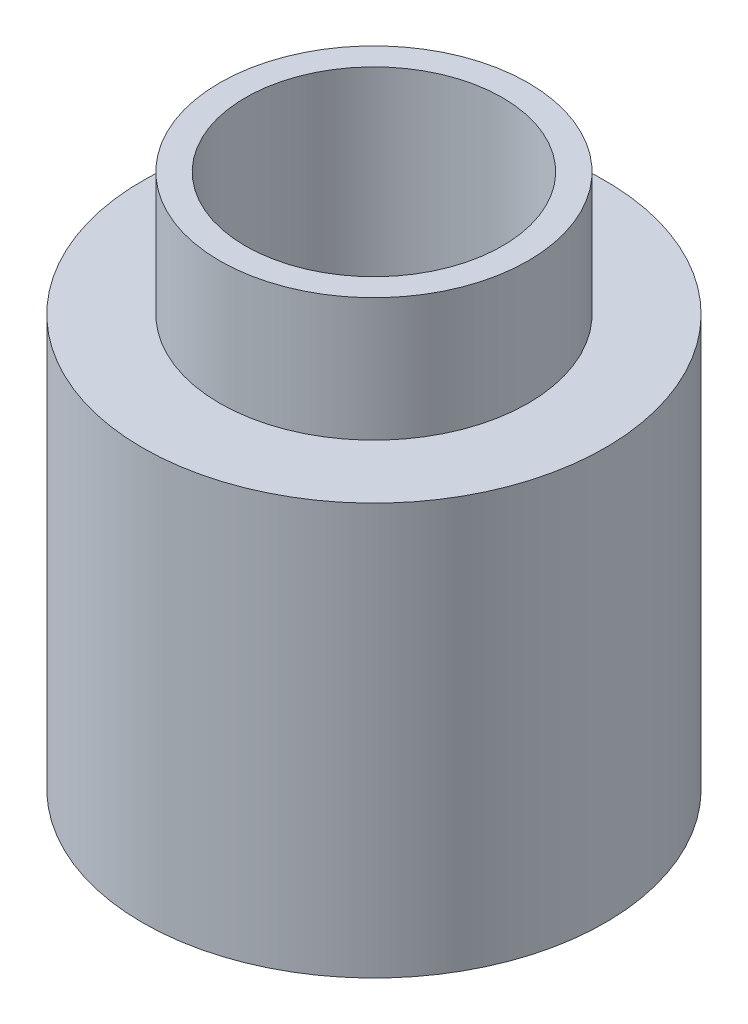
ISO-10303-21;
HEADER;
FILE_DESCRIPTION(('STEP AP214'),'2;1');
FILE_NAME('part.step','',(''),(''),'','','');
FILE_SCHEMA(('AUTOMOTIVE_DESIGN { 1 0 10303 214 1 1 1 1 }'));
ENDSEC;
DATA;
#1=APPLICATION_CONTEXT('core data for automotive mechanical design processes');
#2=APPLICATION_PROTOCOL_DEFINITION('international standard','automotive_design',2000,#1);
#3=PRODUCT_CONTEXT('',#1,'mechanical');
#4=PRODUCT('Part','Part','',(#3));
#5=PRODUCT_RELATED_PRODUCT_CATEGORY('part','',(#4));
#6=PRODUCT_DEFINITION_FORMATION('','',#4);
#7=PRODUCT_DEFINITION_CONTEXT('part definition',#1,'design');
#8=PRODUCT_DEFINITION('design','',#6,#7);
#9=PRODUCT_DEFINITION_SHAPE('','',#8);
#10=(LENGTH_UNIT() NAMED_UNIT(*) SI_UNIT(.MILLI.,.METRE.));
#11=(NAMED_UNIT(*) PLANE_ANGLE_UNIT() SI_UNIT($,.RADIAN.));
#12=(NAMED_UNIT(*) SI_UNIT($,.STERADIAN.) SOLID_ANGLE_UNIT());
#13=UNCERTAINTY_MEASURE_WITH_UNIT(LENGTH_MEASURE(1.E-05),#10,'distance_accuracy_value','');
#14=(GEOMETRIC_REPRESENTATION_CONTEXT(3) GLOBAL_UNCERTAINTY_ASSIGNED_CONTEXT((#13)) GLOBAL_UNIT_ASSIGNED_CONTEXT((#10,
#11,#12)) REPRESENTATION_CONTEXT('',''));
#15=CARTESIAN_POINT('',(0.,0.,0.));
#16=DIRECTION('',(0.,0.,1.));
#17=DIRECTION('',(1.,0.,0.));
#18=AXIS2_PLACEMENT_3D('',#15,#16,#17);
#19=CARTESIAN_POINT('',(0.,4.,0.));
#20=DIRECTION('',(0.,1.,0.));
#21=DIRECTION('',(0.,0.,1.));
#22=AXIS2_PLACEMENT_3D('',#19,#20,#21);
#23=PLANE('',#22);
#24=CARTESIAN_POINT('',(0.,4.,0.));
#25=DIRECTION('',(0.,1.,0.));
#26=DIRECTION('',(0.,0.,1.));
#27=AXIS2_PLACEMENT_3D('',#24,#25,#26);
#28=CIRCLE('',#27,2.25);
#29=CARTESIAN_POINT('',(0.,4.,2.25));
#30=VERTEX_POINT('',#29);
#31=EDGE_CURVE('E10',#30,#30,#28,.T.);
#32=ORIENTED_EDGE('',*,*,#31,.T.);
#33=EDGE_LOOP('',(#32));
#34=FACE_BOUND('',#33,.T.);
#35=CARTESIAN_POINT('',(0.,4.,0.));
#36=DIRECTION('',(0.,1.,0.));
#37=DIRECTION('',(0.,0.,1.));
#38=AXIS2_PLACEMENT_3D('',#35,#36,#37);
#39=CIRCLE('',#38,1.5);
#40=CARTESIAN_POINT('',(0.,4.,1.5));
#41=VERTEX_POINT('',#40);
#42=EDGE_CURVE('E53',#41,#41,#39,.T.);
#43=ORIENTED_EDGE('',*,*,#42,.F.);
#44=EDGE_LOOP('',(#43));
#45=FACE_BOUND('',#44,.T.);
#46=ADVANCED_FACE('F37',(#34,#45),#23,.T.);
#47=CARTESIAN_POINT('',(0.,0.,0.));
#48=DIRECTION('',(0.,1.,0.));
#49=DIRECTION('',(0.,0.,1.));
#50=AXIS2_PLACEMENT_3D('',#47,#48,#49);
#51=PLANE('',#50);
#52=CARTESIAN_POINT('',(0.,0.,0.));
#53=DIRECTION('',(0.,1.,0.));
#54=DIRECTION('',(0.,0.,1.));
#55=AXIS2_PLACEMENT_3D('',#52,#53,#54);
#56=CIRCLE('',#55,2.25);
#57=CARTESIAN_POINT('',(0.,0.,2.25));
#58=VERTEX_POINT('',#57);
#59=EDGE_CURVE('E41',#58,#58,#56,.T.);
#60=ORIENTED_EDGE('',*,*,#59,.F.);
#61=EDGE_LOOP('',(#60));
#62=FACE_BOUND('',#61,.T.);
#63=CARTESIAN_POINT('',(0.,0.,0.));
#64=DIRECTION('',(0.,1.,0.));
#65=DIRECTION('',(0.,0.,1.));
#66=AXIS2_PLACEMENT_3D('',#63,#64,#65);
#67=CIRCLE('',#66,1.25);
#68=CARTESIAN_POINT('',(0.,0.,1.25));
#69=VERTEX_POINT('',#68);
#70=EDGE_CURVE('E48',#69,#69,#67,.T.);
#71=ORIENTED_EDGE('',*,*,#70,.T.);
#72=EDGE_LOOP('',(#71));
#73=FACE_BOUND('',#72,.T.);
#74=ADVANCED_FACE('F78',(#62,#73),#51,.F.);
#75=CARTESIAN_POINT('',(0.,4.,0.));
#76=DIRECTION('',(0.,-1.,0.));
#77=DIRECTION('',(0.,0.,-1.));
#78=AXIS2_PLACEMENT_3D('',#75,#76,#77);
#79=CYLINDRICAL_SURFACE('',#78,2.25);
#80=ORIENTED_EDGE('',*,*,#31,.F.);
#81=EDGE_LOOP('',(#80));
#82=FACE_BOUND('',#81,.T.);
#83=ORIENTED_EDGE('',*,*,#59,.T.);
#84=EDGE_LOOP('',(#83));
#85=FACE_BOUND('',#84,.T.);
#86=ADVANCED_FACE('F39',(#82,#85),#79,.T.);
#87=CARTESIAN_POINT('',(0.,4.,0.));
#88=DIRECTION('',(0.,-1.,0.));
#89=DIRECTION('',(0.,0.,-1.));
#90=AXIS2_PLACEMENT_3D('',#87,#88,#89);
#91=CYLINDRICAL_SURFACE('',#90,1.25);
#92=ORIENTED_EDGE('',*,*,#70,.F.);
#93=EDGE_LOOP('',(#92));
#94=FACE_BOUND('',#93,.T.);
#95=CARTESIAN_POINT('',(0.,5.2,0.));
#96=DIRECTION('',(0.,1.,0.));
#97=DIRECTION('',(0.,0.,1.));
#98=AXIS2_PLACEMENT_3D('',#95,#96,#97);
#99=CIRCLE('',#98,1.25);
#100=CARTESIAN_POINT('',(0.,5.2,1.25));
#101=VERTEX_POINT('',#100);
#102=EDGE_CURVE('E56',#101,#101,#99,.T.);
#103=ORIENTED_EDGE('',*,*,#102,.T.);
#104=EDGE_LOOP('',(#103));
#105=FACE_BOUND('',#104,.T.);
#106=ADVANCED_FACE('F62',(#94,#105),#91,.F.);
#107=CARTESIAN_POINT('',(0.,5.2,0.));
#108=DIRECTION('',(0.,1.,0.));
#109=DIRECTION('',(0.,0.,1.));
#110=AXIS2_PLACEMENT_3D('',#107,#108,#109);
#111=PLANE('',#110);
#112=CARTESIAN_POINT('',(0.,5.2,0.));
#113=DIRECTION('',(0.,1.,0.));
#114=DIRECTION('',(0.,0.,1.));
#115=AXIS2_PLACEMENT_3D('',#112,#113,#114);
#116=CIRCLE('',#115,1.5);
#117=CARTESIAN_POINT('',(0.,5.2,1.5));
#118=VERTEX_POINT('',#117);
#119=EDGE_CURVE('E52',#118,#118,#116,.T.);
#120=ORIENTED_EDGE('',*,*,#119,.T.);
#121=EDGE_LOOP('',(#120));
#122=FACE_BOUND('',#121,.T.);
#123=ORIENTED_EDGE('',*,*,#102,.F.);
#124=EDGE_LOOP('',(#123));
#125=FACE_BOUND('',#124,.T.);
#126=ADVANCED_FACE('F64',(#122,#125),#111,.T.);
#127=CARTESIAN_POINT('',(0.,5.2,0.));
#128=DIRECTION('',(0.,-1.,0.));
#129=DIRECTION('',(0.,0.,-1.));
#130=AXIS2_PLACEMENT_3D('',#127,#128,#129);
#131=CYLINDRICAL_SURFACE('',#130,1.5);
#132=ORIENTED_EDGE('',*,*,#119,.F.);
#133=EDGE_LOOP('',(#132));
#134=FACE_BOUND('',#133,.T.);
#135=ORIENTED_EDGE('',*,*,#42,.T.);
#136=EDGE_LOOP('',(#135));
#137=FACE_BOUND('',#136,.T.);
#138=ADVANCED_FACE('F66',(#134,#137),#131,.T.);
#139=CLOSED_SHELL('',(#46,#74,#86,#106,#126,#138));
#140=MANIFOLD_SOLID_BREP('B2',#139);
#141=ADVANCED_BREP_SHAPE_REPRESENTATION('',(#18,#140),#14);
#142=SHAPE_DEFINITION_REPRESENTATION(#9,#141);
ENDSEC;
END-ISO-10303-21;
